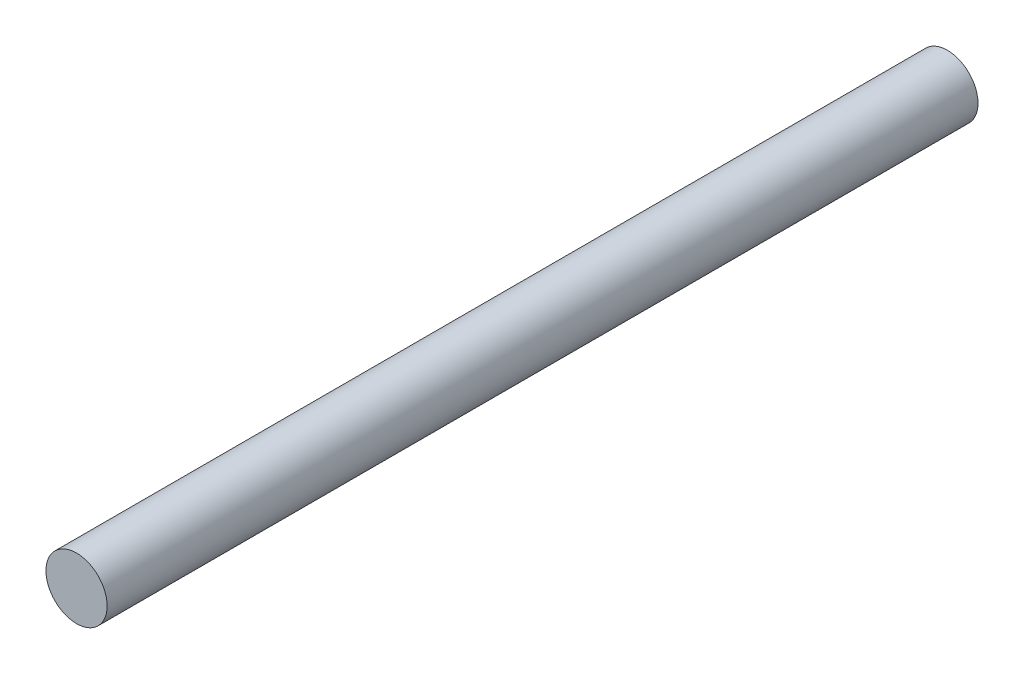
ISO-10303-21;
HEADER;
FILE_DESCRIPTION(('STEP AP214'),'2;1');
FILE_NAME('part.step','',(''),(''),'','','');
FILE_SCHEMA(('AUTOMOTIVE_DESIGN { 1 0 10303 214 1 1 1 1 }'));
ENDSEC;
DATA;
#1=APPLICATION_CONTEXT('core data for automotive mechanical design processes');
#2=APPLICATION_PROTOCOL_DEFINITION('international standard','automotive_design',2000,#1);
#3=PRODUCT_CONTEXT('',#1,'mechanical');
#4=PRODUCT('Part','Part','',(#3));
#5=PRODUCT_RELATED_PRODUCT_CATEGORY('part','',(#4));
#6=PRODUCT_DEFINITION_FORMATION('','',#4);
#7=PRODUCT_DEFINITION_CONTEXT('part definition',#1,'design');
#8=PRODUCT_DEFINITION('design','',#6,#7);
#9=PRODUCT_DEFINITION_SHAPE('','',#8);
#10=(LENGTH_UNIT() NAMED_UNIT(*) SI_UNIT(.MILLI.,.METRE.));
#11=(NAMED_UNIT(*) PLANE_ANGLE_UNIT() SI_UNIT($,.RADIAN.));
#12=(NAMED_UNIT(*) SI_UNIT($,.STERADIAN.) SOLID_ANGLE_UNIT());
#13=UNCERTAINTY_MEASURE_WITH_UNIT(LENGTH_MEASURE(1.E-05),#10,'distance_accuracy_value','');
#14=(GEOMETRIC_REPRESENTATION_CONTEXT(3) GLOBAL_UNCERTAINTY_ASSIGNED_CONTEXT((#13)) GLOBAL_UNIT_ASSIGNED_CONTEXT((#10,
#11,#12)) REPRESENTATION_CONTEXT('',''));
#15=CARTESIAN_POINT('',(0.,0.,0.));
#16=DIRECTION('',(0.,0.,1.));
#17=DIRECTION('',(1.,0.,0.));
#18=AXIS2_PLACEMENT_3D('',#15,#16,#17);
#19=CARTESIAN_POINT('',(0.,0.,56.92));
#20=DIRECTION('',(0.,0.,-1.));
#21=DIRECTION('',(-1.,0.,0.));
#22=AXIS2_PLACEMENT_3D('',#19,#20,#21);
#23=CYLINDRICAL_SURFACE('',#22,2.);
#24=CARTESIAN_POINT('',(0.,0.,56.92));
#25=DIRECTION('',(0.,0.,1.));
#26=DIRECTION('',(1.,0.,0.));
#27=AXIS2_PLACEMENT_3D('',#24,#25,#26);
#28=CIRCLE('',#27,2.);
#29=CARTESIAN_POINT('',(2.,0.,56.92));
#30=VERTEX_POINT('',#29);
#31=EDGE_CURVE('E10',#30,#30,#28,.T.);
#32=ORIENTED_EDGE('',*,*,#31,.F.);
#33=EDGE_LOOP('',(#32));
#34=FACE_BOUND('',#33,.T.);
#35=CARTESIAN_POINT('',(0.,0.,0.));
#36=DIRECTION('',(0.,0.,1.));
#37=DIRECTION('',(1.,0.,0.));
#38=AXIS2_PLACEMENT_3D('',#35,#36,#37);
#39=CIRCLE('',#38,2.);
#40=CARTESIAN_POINT('',(2.,0.,0.));
#41=VERTEX_POINT('',#40);
#42=EDGE_CURVE('E40',#41,#41,#39,.T.);
#43=ORIENTED_EDGE('',*,*,#42,.T.);
#44=EDGE_LOOP('',(#43));
#45=FACE_BOUND('',#44,.T.);
#46=ADVANCED_FACE('F37',(#34,#45),#23,.T.);
#47=CARTESIAN_POINT('',(0.,0.,56.92));
#48=DIRECTION('',(0.,0.,1.));
#49=DIRECTION('',(1.,0.,0.));
#50=AXIS2_PLACEMENT_3D('',#47,#48,#49);
#51=PLANE('',#50);
#52=ORIENTED_EDGE('',*,*,#31,.T.);
#53=EDGE_LOOP('',(#52));
#54=FACE_BOUND('',#53,.T.);
#55=ADVANCED_FACE('F52',(#54),#51,.T.);
#56=CARTESIAN_POINT('',(0.,0.,0.));
#57=DIRECTION('',(0.,0.,1.));
#58=DIRECTION('',(1.,0.,0.));
#59=AXIS2_PLACEMENT_3D('',#56,#57,#58);
#60=PLANE('',#59);
#61=ORIENTED_EDGE('',*,*,#42,.F.);
#62=EDGE_LOOP('',(#61));
#63=FACE_BOUND('',#62,.T.);
#64=ADVANCED_FACE('F50',(#63),#60,.F.);
#65=CLOSED_SHELL('',(#46,#55,#64));
#66=MANIFOLD_SOLID_BREP('B2',#65);
#67=ADVANCED_BREP_SHAPE_REPRESENTATION('',(#18,#66),#14);
#68=SHAPE_DEFINITION_REPRESENTATION(#9,#67);
ENDSEC;
END-ISO-10303-21;
